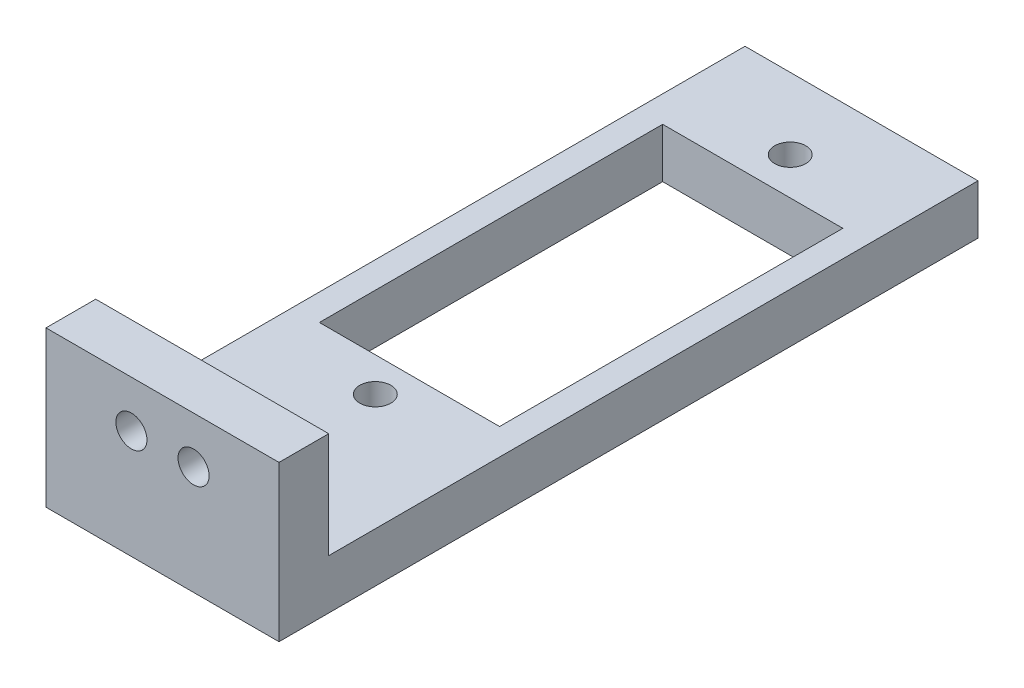
ISO-10303-21;
HEADER;
FILE_DESCRIPTION(('STEP AP214'),'2;1');
FILE_NAME('part.step','',(''),(''),'','','');
FILE_SCHEMA(('AUTOMOTIVE_DESIGN { 1 0 10303 214 1 1 1 1 }'));
ENDSEC;
DATA;
#1=APPLICATION_CONTEXT('core data for automotive mechanical design processes');
#2=APPLICATION_PROTOCOL_DEFINITION('international standard','automotive_design',2000,#1);
#3=PRODUCT_CONTEXT('',#1,'mechanical');
#4=PRODUCT('Part','Part','',(#3));
#5=PRODUCT_RELATED_PRODUCT_CATEGORY('part','',(#4));
#6=PRODUCT_DEFINITION_FORMATION('','',#4);
#7=PRODUCT_DEFINITION_CONTEXT('part definition',#1,'design');
#8=PRODUCT_DEFINITION('design','',#6,#7);
#9=PRODUCT_DEFINITION_SHAPE('','',#8);
#10=(LENGTH_UNIT() NAMED_UNIT(*) SI_UNIT(.MILLI.,.METRE.));
#11=(NAMED_UNIT(*) PLANE_ANGLE_UNIT() SI_UNIT($,.RADIAN.));
#12=(NAMED_UNIT(*) SI_UNIT($,.STERADIAN.) SOLID_ANGLE_UNIT());
#13=UNCERTAINTY_MEASURE_WITH_UNIT(LENGTH_MEASURE(1.E-05),#10,'distance_accuracy_value','');
#14=(GEOMETRIC_REPRESENTATION_CONTEXT(3) GLOBAL_UNCERTAINTY_ASSIGNED_CONTEXT((#13)) GLOBAL_UNIT_ASSIGNED_CONTEXT((#10,
#11,#12)) REPRESENTATION_CONTEXT('',''));
#15=CARTESIAN_POINT('',(0.,0.,0.));
#16=DIRECTION('',(0.,0.,1.));
#17=DIRECTION('',(1.,0.,0.));
#18=AXIS2_PLACEMENT_3D('',#15,#16,#17);
#19=CARTESIAN_POINT('',(7.5,10.,-22.5));
#20=DIRECTION('',(-1.,0.,0.));
#21=DIRECTION('',(0.,0.,1.));
#22=AXIS2_PLACEMENT_3D('',#19,#20,#21);
#23=PLANE('',#22);
#24=DIRECTION('',(0.,-1.,0.));
#25=VECTOR('',#24,1.);
#26=CARTESIAN_POINT('',(7.5,10.,-22.5));
#27=LINE('',#26,#25);
#28=CARTESIAN_POINT('',(7.5,3.2,-22.5));
#29=VERTEX_POINT('',#28);
#30=CARTESIAN_POINT('',(7.5,0.,-22.5));
#31=VERTEX_POINT('',#30);
#32=EDGE_CURVE('E11',#29,#31,#27,.T.);
#33=ORIENTED_EDGE('',*,*,#32,.F.);
#34=DIRECTION('',(0.,0.,-1.));
#35=VECTOR('',#34,1.);
#36=CARTESIAN_POINT('',(7.5,3.2,19.3));
#37=LINE('',#36,#35);
#38=CARTESIAN_POINT('',(7.5,3.2,19.3));
#39=VERTEX_POINT('',#38);
#40=EDGE_CURVE('E195',#39,#29,#37,.T.);
#41=ORIENTED_EDGE('',*,*,#40,.F.);
#42=DIRECTION('',(0.,-1.,0.));
#43=VECTOR('',#42,1.);
#44=CARTESIAN_POINT('',(7.5,3.2,19.3));
#45=LINE('',#44,#43);
#46=CARTESIAN_POINT('',(7.5,10.,19.3));
#47=VERTEX_POINT('',#46);
#48=EDGE_CURVE('E180',#47,#39,#45,.T.);
#49=ORIENTED_EDGE('',*,*,#48,.F.);
#50=DIRECTION('',(0.,0.,-1.));
#51=VECTOR('',#50,1.);
#52=CARTESIAN_POINT('',(7.5,10.,-22.5));
#53=LINE('',#52,#51);
#54=CARTESIAN_POINT('',(7.5,10.,22.5));
#55=VERTEX_POINT('',#54);
#56=EDGE_CURVE('E205',#55,#47,#53,.T.);
#57=ORIENTED_EDGE('',*,*,#56,.F.);
#58=DIRECTION('',(0.,-1.,0.));
#59=VECTOR('',#58,1.);
#60=CARTESIAN_POINT('',(7.5,10.,22.5));
#61=LINE('',#60,#59);
#62=CARTESIAN_POINT('',(7.5,0.,22.5));
#63=VERTEX_POINT('',#62);
#64=EDGE_CURVE('E216',#55,#63,#61,.T.);
#65=ORIENTED_EDGE('',*,*,#64,.T.);
#66=DIRECTION('',(0.,0.,-1.));
#67=VECTOR('',#66,1.);
#68=CARTESIAN_POINT('',(7.5,0.,-22.5));
#69=LINE('',#68,#67);
#70=EDGE_CURVE('E202',#63,#31,#69,.T.);
#71=ORIENTED_EDGE('',*,*,#70,.T.);
#72=EDGE_LOOP('',(#33,#41,#49,#57,#65,#71));
#73=FACE_BOUND('',#72,.T.);
#74=ADVANCED_FACE('F41',(#73),#23,.F.);
#75=CARTESIAN_POINT('',(-7.5,10.,-22.5));
#76=DIRECTION('',(0.,0.,1.));
#77=DIRECTION('',(1.,0.,0.));
#78=AXIS2_PLACEMENT_3D('',#75,#76,#77);
#79=PLANE('',#78);
#80=DIRECTION('',(0.,-1.,0.));
#81=VECTOR('',#80,1.);
#82=CARTESIAN_POINT('',(-7.5,10.,-22.5));
#83=LINE('',#82,#81);
#84=CARTESIAN_POINT('',(-7.5,3.2,-22.5));
#85=VERTEX_POINT('',#84);
#86=CARTESIAN_POINT('',(-7.5,0.,-22.5));
#87=VERTEX_POINT('',#86);
#88=EDGE_CURVE('E50',#85,#87,#83,.T.);
#89=ORIENTED_EDGE('',*,*,#88,.F.);
#90=DIRECTION('',(-1.,0.,0.));
#91=VECTOR('',#90,1.);
#92=CARTESIAN_POINT('',(7.5,3.2,-22.5));
#93=LINE('',#92,#91);
#94=EDGE_CURVE('E185',#29,#85,#93,.T.);
#95=ORIENTED_EDGE('',*,*,#94,.F.);
#96=ORIENTED_EDGE('',*,*,#32,.T.);
#97=DIRECTION('',(-1.,0.,0.));
#98=VECTOR('',#97,1.);
#99=CARTESIAN_POINT('',(-7.5,0.,-22.5));
#100=LINE('',#99,#98);
#101=EDGE_CURVE('E220',#31,#87,#100,.T.);
#102=ORIENTED_EDGE('',*,*,#101,.T.);
#103=EDGE_LOOP('',(#89,#95,#96,#102));
#104=FACE_BOUND('',#103,.T.);
#105=ADVANCED_FACE('F261',(#104),#79,.F.);
#106=CARTESIAN_POINT('',(-7.5,10.,-22.5));
#107=DIRECTION('',(1.,0.,0.));
#108=DIRECTION('',(0.,0.,-1.));
#109=AXIS2_PLACEMENT_3D('',#106,#107,#108);
#110=PLANE('',#109);
#111=DIRECTION('',(0.,1.,0.));
#112=VECTOR('',#111,1.);
#113=CARTESIAN_POINT('',(-7.5,3.2,19.3));
#114=LINE('',#113,#112);
#115=CARTESIAN_POINT('',(-7.5,3.2,19.3));
#116=VERTEX_POINT('',#115);
#117=CARTESIAN_POINT('',(-7.5,10.,19.3));
#118=VERTEX_POINT('',#117);
#119=EDGE_CURVE('E189',#116,#118,#114,.T.);
#120=ORIENTED_EDGE('',*,*,#119,.F.);
#121=DIRECTION('',(0.,0.,-1.));
#122=VECTOR('',#121,1.);
#123=CARTESIAN_POINT('',(-7.5,3.2,19.3));
#124=LINE('',#123,#122);
#125=EDGE_CURVE('E198',#116,#85,#124,.T.);
#126=ORIENTED_EDGE('',*,*,#125,.T.);
#127=ORIENTED_EDGE('',*,*,#88,.T.);
#128=DIRECTION('',(0.,0.,1.));
#129=VECTOR('',#128,1.);
#130=CARTESIAN_POINT('',(-7.5,0.,-22.5));
#131=LINE('',#130,#129);
#132=CARTESIAN_POINT('',(-7.5,0.,22.5));
#133=VERTEX_POINT('',#132);
#134=EDGE_CURVE('E224',#87,#133,#131,.T.);
#135=ORIENTED_EDGE('',*,*,#134,.T.);
#136=DIRECTION('',(0.,-1.,0.));
#137=VECTOR('',#136,1.);
#138=CARTESIAN_POINT('',(-7.5,10.,22.5));
#139=LINE('',#138,#137);
#140=CARTESIAN_POINT('',(-7.5,10.,22.5));
#141=VERTEX_POINT('',#140);
#142=EDGE_CURVE('E232',#141,#133,#139,.T.);
#143=ORIENTED_EDGE('',*,*,#142,.F.);
#144=DIRECTION('',(0.,0.,1.));
#145=VECTOR('',#144,1.);
#146=CARTESIAN_POINT('',(-7.5,10.,-22.5));
#147=LINE('',#146,#145);
#148=EDGE_CURVE('E209',#118,#141,#147,.T.);
#149=ORIENTED_EDGE('',*,*,#148,.F.);
#150=EDGE_LOOP('',(#120,#126,#127,#135,#143,#149));
#151=FACE_BOUND('',#150,.T.);
#152=ADVANCED_FACE('F266',(#151),#110,.F.);
#153=CARTESIAN_POINT('',(-7.5,10.,22.5));
#154=DIRECTION('',(0.,0.,-1.));
#155=DIRECTION('',(-1.,0.,0.));
#156=AXIS2_PLACEMENT_3D('',#153,#154,#155);
#157=PLANE('',#156);
#158=CARTESIAN_POINT('',(-2.,7.,22.5));
#159=DIRECTION('',(0.,0.,1.));
#160=DIRECTION('',(1.,0.,0.));
#161=AXIS2_PLACEMENT_3D('',#158,#159,#160);
#162=CIRCLE('',#161,0.99999999999984);
#163=CARTESIAN_POINT('',(-1.00000000000016,7.,22.5));
#164=VERTEX_POINT('',#163);
#165=EDGE_CURVE('E172',#164,#164,#162,.T.);
#166=ORIENTED_EDGE('',*,*,#165,.F.);
#167=EDGE_LOOP('',(#166));
#168=FACE_BOUND('',#167,.T.);
#169=CARTESIAN_POINT('',(2.,7.,22.5));
#170=DIRECTION('',(0.,0.,1.));
#171=DIRECTION('',(1.,0.,0.));
#172=AXIS2_PLACEMENT_3D('',#169,#170,#171);
#173=CIRCLE('',#172,1.);
#174=CARTESIAN_POINT('',(3.,7.,22.5));
#175=VERTEX_POINT('',#174);
#176=EDGE_CURVE('E166',#175,#175,#173,.T.);
#177=ORIENTED_EDGE('',*,*,#176,.F.);
#178=EDGE_LOOP('',(#177));
#179=FACE_BOUND('',#178,.T.);
#180=DIRECTION('',(1.,0.,0.));
#181=VECTOR('',#180,1.);
#182=CARTESIAN_POINT('',(-7.5,0.,22.5));
#183=LINE('',#182,#181);
#184=EDGE_CURVE('E210',#133,#63,#183,.T.);
#185=ORIENTED_EDGE('',*,*,#184,.T.);
#186=ORIENTED_EDGE('',*,*,#64,.F.);
#187=DIRECTION('',(1.,0.,0.));
#188=VECTOR('',#187,1.);
#189=CARTESIAN_POINT('',(-7.5,10.,22.5));
#190=LINE('',#189,#188);
#191=EDGE_CURVE('E213',#141,#55,#190,.T.);
#192=ORIENTED_EDGE('',*,*,#191,.F.);
#193=ORIENTED_EDGE('',*,*,#142,.T.);
#194=EDGE_LOOP('',(#185,#186,#192,#193));
#195=FACE_BOUND('',#194,.T.);
#196=ADVANCED_FACE('F283',(#168,#179,#195),#157,.F.);
#197=CARTESIAN_POINT('',(0.,10.,0.));
#198=DIRECTION('',(0.,1.,0.));
#199=DIRECTION('',(0.,0.,1.));
#200=AXIS2_PLACEMENT_3D('',#197,#198,#199);
#201=PLANE('',#200);
#202=DIRECTION('',(1.,0.,0.));
#203=VECTOR('',#202,1.);
#204=CARTESIAN_POINT('',(7.5,10.,19.3));
#205=LINE('',#204,#203);
#206=EDGE_CURVE('E192',#118,#47,#205,.T.);
#207=ORIENTED_EDGE('',*,*,#206,.F.);
#208=ORIENTED_EDGE('',*,*,#148,.T.);
#209=ORIENTED_EDGE('',*,*,#191,.T.);
#210=ORIENTED_EDGE('',*,*,#56,.T.);
#211=EDGE_LOOP('',(#207,#208,#209,#210));
#212=FACE_BOUND('',#211,.T.);
#213=ADVANCED_FACE('F288',(#212),#201,.T.);
#214=CARTESIAN_POINT('',(0.,0.,0.));
#215=DIRECTION('',(0.,1.,0.));
#216=DIRECTION('',(0.,0.,1.));
#217=AXIS2_PLACEMENT_3D('',#214,#215,#216);
#218=PLANE('',#217);
#219=CARTESIAN_POINT('',(0.,0.,-17.91));
#220=DIRECTION('',(0.,1.,0.));
#221=DIRECTION('',(0.,0.,1.));
#222=AXIS2_PLACEMENT_3D('',#219,#220,#221);
#223=CIRCLE('',#222,1.);
#224=CARTESIAN_POINT('',(0.,0.,-16.91));
#225=VERTEX_POINT('',#224);
#226=EDGE_CURVE('E396',#225,#225,#223,.T.);
#227=ORIENTED_EDGE('',*,*,#226,.T.);
#228=EDGE_LOOP('',(#227));
#229=FACE_BOUND('',#228,.T.);
#230=CARTESIAN_POINT('',(0.,0.,8.80000000000001));
#231=DIRECTION('',(0.,1.,0.));
#232=DIRECTION('',(0.,0.,1.));
#233=AXIS2_PLACEMENT_3D('',#230,#231,#232);
#234=CIRCLE('',#233,1.);
#235=CARTESIAN_POINT('',(0.,0.,9.80000000000001));
#236=VERTEX_POINT('',#235);
#237=EDGE_CURVE('E157',#236,#236,#234,.T.);
#238=ORIENTED_EDGE('',*,*,#237,.T.);
#239=EDGE_LOOP('',(#238));
#240=FACE_BOUND('',#239,.T.);
#241=DIRECTION('',(-1.,0.,0.));
#242=VECTOR('',#241,1.);
#243=CARTESIAN_POINT('',(5.8,0.,-15.5));
#244=LINE('',#243,#242);
#245=CARTESIAN_POINT('',(5.8,0.,-15.5));
#246=VERTEX_POINT('',#245);
#247=CARTESIAN_POINT('',(-5.8,0.,-15.5));
#248=VERTEX_POINT('',#247);
#249=EDGE_CURVE('E128',#246,#248,#244,.T.);
#250=ORIENTED_EDGE('',*,*,#249,.T.);
#251=DIRECTION('',(0.,0.,1.));
#252=VECTOR('',#251,1.);
#253=CARTESIAN_POINT('',(-5.8,0.,-15.5));
#254=LINE('',#253,#252);
#255=CARTESIAN_POINT('',(-5.8,0.,6.60000000000001));
#256=VERTEX_POINT('',#255);
#257=EDGE_CURVE('E121',#248,#256,#254,.T.);
#258=ORIENTED_EDGE('',*,*,#257,.T.);
#259=DIRECTION('',(1.,0.,0.));
#260=VECTOR('',#259,1.);
#261=CARTESIAN_POINT('',(5.8,0.,6.60000000000001));
#262=LINE('',#261,#260);
#263=CARTESIAN_POINT('',(5.8,0.,6.60000000000001));
#264=VERTEX_POINT('',#263);
#265=EDGE_CURVE('E131',#256,#264,#262,.T.);
#266=ORIENTED_EDGE('',*,*,#265,.T.);
#267=DIRECTION('',(0.,0.,-1.));
#268=VECTOR('',#267,1.);
#269=CARTESIAN_POINT('',(5.8,0.,-15.5));
#270=LINE('',#269,#268);
#271=EDGE_CURVE('E58',#264,#246,#270,.T.);
#272=ORIENTED_EDGE('',*,*,#271,.T.);
#273=EDGE_LOOP('',(#250,#258,#266,#272));
#274=FACE_BOUND('',#273,.T.);
#275=ORIENTED_EDGE('',*,*,#70,.F.);
#276=ORIENTED_EDGE('',*,*,#184,.F.);
#277=ORIENTED_EDGE('',*,*,#134,.F.);
#278=ORIENTED_EDGE('',*,*,#101,.F.);
#279=EDGE_LOOP('',(#275,#276,#277,#278));
#280=FACE_BOUND('',#279,.T.);
#281=ADVANCED_FACE('F136',(#229,#240,#274,#280),#218,.F.);
#282=CARTESIAN_POINT('',(7.5,3.2,19.3));
#283=DIRECTION('',(0.,-1.,0.));
#284=DIRECTION('',(0.,0.,-1.));
#285=AXIS2_PLACEMENT_3D('',#282,#283,#284);
#286=PLANE('',#285);
#287=CARTESIAN_POINT('',(0.,3.2,-17.91));
#288=DIRECTION('',(0.,1.,0.));
#289=DIRECTION('',(0.,0.,1.));
#290=AXIS2_PLACEMENT_3D('',#287,#288,#289);
#291=CIRCLE('',#290,1.);
#292=CARTESIAN_POINT('',(0.,3.2,-16.91));
#293=VERTEX_POINT('',#292);
#294=EDGE_CURVE('E147',#293,#293,#291,.T.);
#295=ORIENTED_EDGE('',*,*,#294,.F.);
#296=EDGE_LOOP('',(#295));
#297=FACE_BOUND('',#296,.T.);
#298=CARTESIAN_POINT('',(0.,3.2,8.80000000000001));
#299=DIRECTION('',(0.,1.,0.));
#300=DIRECTION('',(0.,0.,1.));
#301=AXIS2_PLACEMENT_3D('',#298,#299,#300);
#302=CIRCLE('',#301,1.);
#303=CARTESIAN_POINT('',(0.,3.2,9.80000000000001));
#304=VERTEX_POINT('',#303);
#305=EDGE_CURVE('E400',#304,#304,#302,.T.);
#306=ORIENTED_EDGE('',*,*,#305,.F.);
#307=EDGE_LOOP('',(#306));
#308=FACE_BOUND('',#307,.T.);
#309=DIRECTION('',(1.,0.,0.));
#310=VECTOR('',#309,1.);
#311=CARTESIAN_POINT('',(5.8,3.2,6.60000000000001));
#312=LINE('',#311,#310);
#313=CARTESIAN_POINT('',(-5.8,3.2,6.60000000000001));
#314=VERTEX_POINT('',#313);
#315=CARTESIAN_POINT('',(5.8,3.2,6.60000000000001));
#316=VERTEX_POINT('',#315);
#317=EDGE_CURVE('E156',#314,#316,#312,.T.);
#318=ORIENTED_EDGE('',*,*,#317,.F.);
#319=DIRECTION('',(0.,0.,1.));
#320=VECTOR('',#319,1.);
#321=CARTESIAN_POINT('',(-5.8,3.2,-15.5));
#322=LINE('',#321,#320);
#323=CARTESIAN_POINT('',(-5.8,3.2,-15.5));
#324=VERTEX_POINT('',#323);
#325=EDGE_CURVE('E66',#324,#314,#322,.T.);
#326=ORIENTED_EDGE('',*,*,#325,.F.);
#327=DIRECTION('',(-1.,0.,0.));
#328=VECTOR('',#327,1.);
#329=CARTESIAN_POINT('',(5.8,3.2,-15.5));
#330=LINE('',#329,#328);
#331=CARTESIAN_POINT('',(5.8,3.2,-15.5));
#332=VERTEX_POINT('',#331);
#333=EDGE_CURVE('E140',#332,#324,#330,.T.);
#334=ORIENTED_EDGE('',*,*,#333,.F.);
#335=DIRECTION('',(0.,0.,-1.));
#336=VECTOR('',#335,1.);
#337=CARTESIAN_POINT('',(5.8,3.2,-15.5));
#338=LINE('',#337,#336);
#339=EDGE_CURVE('E144',#316,#332,#338,.T.);
#340=ORIENTED_EDGE('',*,*,#339,.F.);
#341=EDGE_LOOP('',(#318,#326,#334,#340));
#342=FACE_BOUND('',#341,.T.);
#343=ORIENTED_EDGE('',*,*,#94,.T.);
#344=ORIENTED_EDGE('',*,*,#125,.F.);
#345=DIRECTION('',(-1.,0.,0.));
#346=VECTOR('',#345,1.);
#347=CARTESIAN_POINT('',(7.5,3.2,19.3));
#348=LINE('',#347,#346);
#349=EDGE_CURVE('E184',#39,#116,#348,.T.);
#350=ORIENTED_EDGE('',*,*,#349,.F.);
#351=ORIENTED_EDGE('',*,*,#40,.T.);
#352=EDGE_LOOP('',(#343,#344,#350,#351));
#353=FACE_BOUND('',#352,.T.);
#354=ADVANCED_FACE('F291',(#297,#308,#342,#353),#286,.F.);
#355=CARTESIAN_POINT('',(0.,0.,19.3));
#356=DIRECTION('',(0.,0.,1.));
#357=DIRECTION('',(1.,0.,0.));
#358=AXIS2_PLACEMENT_3D('',#355,#356,#357);
#359=PLANE('',#358);
#360=CARTESIAN_POINT('',(-2.,7.,19.3));
#361=DIRECTION('',(0.,0.,1.));
#362=DIRECTION('',(1.,0.,0.));
#363=AXIS2_PLACEMENT_3D('',#360,#361,#362);
#364=CIRCLE('',#363,0.99999999999984);
#365=CARTESIAN_POINT('',(-1.00000000000016,7.,19.3));
#366=VERTEX_POINT('',#365);
#367=EDGE_CURVE('E44',#366,#366,#364,.T.);
#368=ORIENTED_EDGE('',*,*,#367,.T.);
#369=EDGE_LOOP('',(#368));
#370=FACE_BOUND('',#369,.T.);
#371=CARTESIAN_POINT('',(2.,7.,19.3));
#372=DIRECTION('',(0.,0.,1.));
#373=DIRECTION('',(1.,0.,0.));
#374=AXIS2_PLACEMENT_3D('',#371,#372,#373);
#375=CIRCLE('',#374,1.);
#376=CARTESIAN_POINT('',(3.,7.,19.3));
#377=VERTEX_POINT('',#376);
#378=EDGE_CURVE('E176',#377,#377,#375,.T.);
#379=ORIENTED_EDGE('',*,*,#378,.T.);
#380=EDGE_LOOP('',(#379));
#381=FACE_BOUND('',#380,.T.);
#382=ORIENTED_EDGE('',*,*,#48,.T.);
#383=ORIENTED_EDGE('',*,*,#349,.T.);
#384=ORIENTED_EDGE('',*,*,#119,.T.);
#385=ORIENTED_EDGE('',*,*,#206,.T.);
#386=EDGE_LOOP('',(#382,#383,#384,#385));
#387=FACE_BOUND('',#386,.T.);
#388=ADVANCED_FACE('F245',(#370,#381,#387),#359,.F.);
#389=CARTESIAN_POINT('',(2.,7.,-22.5));
#390=DIRECTION('',(0.,0.,1.));
#391=DIRECTION('',(1.,0.,0.));
#392=AXIS2_PLACEMENT_3D('',#389,#390,#391);
#393=CYLINDRICAL_SURFACE('',#392,1.);
#394=CARTESIAN_POINT('',(3.,7.,22.5));
#395=CARTESIAN_POINT('',(3.,7.,22.4666666666667));
#396=CARTESIAN_POINT('',(3.,7.,22.4333333333333));
#397=CARTESIAN_POINT('',(3.,7.,22.3666666666667));
#398=CARTESIAN_POINT('',(3.,7.,22.3333333333333));
#399=CARTESIAN_POINT('',(3.,7.,22.2666666666667));
#400=CARTESIAN_POINT('',(3.,7.,22.2333333333333));
#401=CARTESIAN_POINT('',(3.,7.,22.1666666666667));
#402=CARTESIAN_POINT('',(3.,7.,22.1333333333333));
#403=CARTESIAN_POINT('',(3.,7.,22.0666666666667));
#404=CARTESIAN_POINT('',(3.,7.,22.0333333333333));
#405=CARTESIAN_POINT('',(3.,7.,21.9666666666667));
#406=CARTESIAN_POINT('',(3.,7.,21.9333333333333));
#407=CARTESIAN_POINT('',(3.,7.,21.8666666666667));
#408=CARTESIAN_POINT('',(3.,7.,21.8333333333333));
#409=CARTESIAN_POINT('',(3.,7.,21.7666666666667));
#410=CARTESIAN_POINT('',(3.,7.,21.7333333333333));
#411=CARTESIAN_POINT('',(3.,7.,21.6666666666667));
#412=CARTESIAN_POINT('',(3.,7.,21.6333333333333));
#413=CARTESIAN_POINT('',(3.,7.,21.5666666666667));
#414=CARTESIAN_POINT('',(3.,7.,21.5333333333333));
#415=CARTESIAN_POINT('',(3.,7.,21.4666666666667));
#416=CARTESIAN_POINT('',(3.,7.,21.4333333333333));
#417=CARTESIAN_POINT('',(3.,7.,21.3666666666667));
#418=CARTESIAN_POINT('',(3.,7.,21.3333333333333));
#419=CARTESIAN_POINT('',(3.,7.,21.2666666666667));
#420=CARTESIAN_POINT('',(3.,7.,21.2333333333333));
#421=CARTESIAN_POINT('',(3.,7.,21.1666666666667));
#422=CARTESIAN_POINT('',(3.,7.,21.1333333333333));
#423=CARTESIAN_POINT('',(3.,7.,21.0666666666667));
#424=CARTESIAN_POINT('',(3.,7.,21.0333333333333));
#425=CARTESIAN_POINT('',(3.,7.,20.9666666666667));
#426=CARTESIAN_POINT('',(3.,7.,20.9333333333333));
#427=CARTESIAN_POINT('',(3.,7.,20.8666666666667));
#428=CARTESIAN_POINT('',(3.,7.,20.8333333333333));
#429=CARTESIAN_POINT('',(3.,7.,20.7666666666667));
#430=CARTESIAN_POINT('',(3.,7.,20.7333333333333));
#431=CARTESIAN_POINT('',(3.,7.,20.6666666666667));
#432=CARTESIAN_POINT('',(3.,7.,20.6333333333333));
#433=CARTESIAN_POINT('',(3.,7.,20.5666666666667));
#434=CARTESIAN_POINT('',(3.,7.,20.5333333333333));
#435=CARTESIAN_POINT('',(3.,7.,20.4666666666667));
#436=CARTESIAN_POINT('',(3.,7.,20.4333333333333));
#437=CARTESIAN_POINT('',(3.,7.,20.3666666666667));
#438=CARTESIAN_POINT('',(3.,7.,20.3333333333333));
#439=CARTESIAN_POINT('',(3.,7.,20.2666666666667));
#440=CARTESIAN_POINT('',(3.,7.,20.2333333333333));
#441=CARTESIAN_POINT('',(3.,7.,20.1666666666667));
#442=CARTESIAN_POINT('',(3.,7.,20.1333333333333));
#443=CARTESIAN_POINT('',(3.,7.,20.0666666666667));
#444=CARTESIAN_POINT('',(3.,7.,20.0333333333333));
#445=CARTESIAN_POINT('',(3.,7.,19.9666666666667));
#446=CARTESIAN_POINT('',(3.,7.,19.9333333333333));
#447=CARTESIAN_POINT('',(3.,7.,19.8666666666667));
#448=CARTESIAN_POINT('',(3.,7.,19.8333333333333));
#449=CARTESIAN_POINT('',(3.,7.,19.7666666666667));
#450=CARTESIAN_POINT('',(3.,7.,19.7333333333333));
#451=CARTESIAN_POINT('',(3.,7.,19.6666666666667));
#452=CARTESIAN_POINT('',(3.,7.,19.6333333333333));
#453=CARTESIAN_POINT('',(3.,7.,19.5666666666667));
#454=CARTESIAN_POINT('',(3.,7.,19.5333333333333));
#455=CARTESIAN_POINT('',(3.,7.,19.4666666666667));
#456=CARTESIAN_POINT('',(3.,7.,19.4333333333333));
#457=CARTESIAN_POINT('',(3.,7.,19.3666666666667));
#458=CARTESIAN_POINT('',(3.,7.,19.3333333333333));
#459=CARTESIAN_POINT('',(3.,7.,19.3));
#460=B_SPLINE_CURVE_WITH_KNOTS('',3,(#394,#395,#396,#397,#398,#399,#400,#401,#402,#403,#404,
#405,#406,#407,#408,#409,#410,#411,#412,#413,#414,#415,#416,#417,#418,#419,#420,#421,#422,#423,
#424,#425,#426,#427,#428,#429,#430,#431,#432,#433,#434,#435,#436,#437,#438,#439,#440,#441,#442,
#443,#444,#445,#446,#447,#448,#449,#450,#451,#452,#453,#454,#455,#456,#457,#458,#459),
.UNSPECIFIED.,.F.,.F.,(4,2,2,2,2,2,2,2,2,2,2,2,2,2,2,2,2,2,2,2,2,2,2,2,2,2,2,2,2,2,2,2,4),(0.,
0.100000000000003,0.199999999999999,0.300000000000002,0.399999999999998,0.5,0.599999999999996,
0.699999999999999,0.799999999999995,0.899999999999998,1.,1.1,1.2,1.3,1.4,1.49999999999999,1.6,
1.7,1.8,1.9,1.99999999999999,2.1,2.19999999999999,2.3,2.4,2.5,2.6,2.69999999999999,2.8,
2.89999999999999,3.,3.09999999999999,3.19999999999999),.UNSPECIFIED.);
#461=EDGE_CURVE('BSEAM249',#175,#377,#460,.T.);
#462=ORIENTED_EDGE('',*,*,#176,.T.);
#463=ORIENTED_EDGE('',*,*,#378,.F.);
#464=ORIENTED_EDGE('',*,*,#461,.T.);
#465=ORIENTED_EDGE('',*,*,#461,.F.);
#466=EDGE_LOOP('',(#462,#464,#463,#465));
#467=FACE_BOUND('',#466,.T.);
#468=ADVANCED_FACE('F249',(#467),#393,.F.);
#469=CARTESIAN_POINT('',(-2.,7.,-22.5));
#470=DIRECTION('',(0.,0.,1.));
#471=DIRECTION('',(1.,0.,0.));
#472=AXIS2_PLACEMENT_3D('',#469,#470,#471);
#473=CYLINDRICAL_SURFACE('',#472,0.99999999999984);
#474=CARTESIAN_POINT('',(-1.00000000000016,7.,22.5));
#475=CARTESIAN_POINT('',(-1.00000000000016,7.,22.4666666666667));
#476=CARTESIAN_POINT('',(-1.00000000000016,7.,22.4333333333333));
#477=CARTESIAN_POINT('',(-1.00000000000016,7.,22.3666666666667));
#478=CARTESIAN_POINT('',(-1.00000000000016,7.,22.3333333333333));
#479=CARTESIAN_POINT('',(-1.00000000000016,7.,22.2666666666667));
#480=CARTESIAN_POINT('',(-1.00000000000016,7.,22.2333333333333));
#481=CARTESIAN_POINT('',(-1.00000000000016,7.,22.1666666666667));
#482=CARTESIAN_POINT('',(-1.00000000000016,7.,22.1333333333333));
#483=CARTESIAN_POINT('',(-1.00000000000016,7.,22.0666666666667));
#484=CARTESIAN_POINT('',(-1.00000000000016,7.,22.0333333333333));
#485=CARTESIAN_POINT('',(-1.00000000000016,7.,21.9666666666667));
#486=CARTESIAN_POINT('',(-1.00000000000016,7.,21.9333333333333));
#487=CARTESIAN_POINT('',(-1.00000000000016,7.,21.8666666666667));
#488=CARTESIAN_POINT('',(-1.00000000000016,7.,21.8333333333333));
#489=CARTESIAN_POINT('',(-1.00000000000016,7.,21.7666666666667));
#490=CARTESIAN_POINT('',(-1.00000000000016,7.,21.7333333333333));
#491=CARTESIAN_POINT('',(-1.00000000000016,7.,21.6666666666667));
#492=CARTESIAN_POINT('',(-1.00000000000016,7.,21.6333333333333));
#493=CARTESIAN_POINT('',(-1.00000000000016,7.,21.5666666666667));
#494=CARTESIAN_POINT('',(-1.00000000000016,7.,21.5333333333333));
#495=CARTESIAN_POINT('',(-1.00000000000016,7.,21.4666666666667));
#496=CARTESIAN_POINT('',(-1.00000000000016,7.,21.4333333333333));
#497=CARTESIAN_POINT('',(-1.00000000000016,7.,21.3666666666667));
#498=CARTESIAN_POINT('',(-1.00000000000016,7.,21.3333333333333));
#499=CARTESIAN_POINT('',(-1.00000000000016,7.,21.2666666666667));
#500=CARTESIAN_POINT('',(-1.00000000000016,7.,21.2333333333333));
#501=CARTESIAN_POINT('',(-1.00000000000016,7.,21.1666666666667));
#502=CARTESIAN_POINT('',(-1.00000000000016,7.,21.1333333333333));
#503=CARTESIAN_POINT('',(-1.00000000000016,7.,21.0666666666667));
#504=CARTESIAN_POINT('',(-1.00000000000016,7.,21.0333333333333));
#505=CARTESIAN_POINT('',(-1.00000000000016,7.,20.9666666666667));
#506=CARTESIAN_POINT('',(-1.00000000000016,7.,20.9333333333333));
#507=CARTESIAN_POINT('',(-1.00000000000016,7.,20.8666666666667));
#508=CARTESIAN_POINT('',(-1.00000000000016,7.,20.8333333333333));
#509=CARTESIAN_POINT('',(-1.00000000000016,7.,20.7666666666667));
#510=CARTESIAN_POINT('',(-1.00000000000016,7.,20.7333333333333));
#511=CARTESIAN_POINT('',(-1.00000000000016,7.,20.6666666666667));
#512=CARTESIAN_POINT('',(-1.00000000000016,7.,20.6333333333333));
#513=CARTESIAN_POINT('',(-1.00000000000016,7.,20.5666666666667));
#514=CARTESIAN_POINT('',(-1.00000000000016,7.,20.5333333333333));
#515=CARTESIAN_POINT('',(-1.00000000000016,7.,20.4666666666667));
#516=CARTESIAN_POINT('',(-1.00000000000016,7.,20.4333333333333));
#517=CARTESIAN_POINT('',(-1.00000000000016,7.,20.3666666666667));
#518=CARTESIAN_POINT('',(-1.00000000000016,7.,20.3333333333333));
#519=CARTESIAN_POINT('',(-1.00000000000016,7.,20.2666666666667));
#520=CARTESIAN_POINT('',(-1.00000000000016,7.,20.2333333333333));
#521=CARTESIAN_POINT('',(-1.00000000000016,7.,20.1666666666667));
#522=CARTESIAN_POINT('',(-1.00000000000016,7.,20.1333333333333));
#523=CARTESIAN_POINT('',(-1.00000000000016,7.,20.0666666666667));
#524=CARTESIAN_POINT('',(-1.00000000000016,7.,20.0333333333333));
#525=CARTESIAN_POINT('',(-1.00000000000016,7.,19.9666666666667));
#526=CARTESIAN_POINT('',(-1.00000000000016,7.,19.9333333333333));
#527=CARTESIAN_POINT('',(-1.00000000000016,7.,19.8666666666667));
#528=CARTESIAN_POINT('',(-1.00000000000016,7.,19.8333333333333));
#529=CARTESIAN_POINT('',(-1.00000000000016,7.,19.7666666666667));
#530=CARTESIAN_POINT('',(-1.00000000000016,7.,19.7333333333333));
#531=CARTESIAN_POINT('',(-1.00000000000016,7.,19.6666666666667));
#532=CARTESIAN_POINT('',(-1.00000000000016,7.,19.6333333333333));
#533=CARTESIAN_POINT('',(-1.00000000000016,7.,19.5666666666667));
#534=CARTESIAN_POINT('',(-1.00000000000016,7.,19.5333333333333));
#535=CARTESIAN_POINT('',(-1.00000000000016,7.,19.4666666666667));
#536=CARTESIAN_POINT('',(-1.00000000000016,7.,19.4333333333333));
#537=CARTESIAN_POINT('',(-1.00000000000016,7.,19.3666666666667));
#538=CARTESIAN_POINT('',(-1.00000000000016,7.,19.3333333333333));
#539=CARTESIAN_POINT('',(-1.00000000000016,7.,19.3));
#540=B_SPLINE_CURVE_WITH_KNOTS('',3,(#474,#475,#476,#477,#478,#479,#480,#481,#482,#483,#484,
#485,#486,#487,#488,#489,#490,#491,#492,#493,#494,#495,#496,#497,#498,#499,#500,#501,#502,#503,
#504,#505,#506,#507,#508,#509,#510,#511,#512,#513,#514,#515,#516,#517,#518,#519,#520,#521,#522,
#523,#524,#525,#526,#527,#528,#529,#530,#531,#532,#533,#534,#535,#536,#537,#538,#539),
.UNSPECIFIED.,.F.,.F.,(4,2,2,2,2,2,2,2,2,2,2,2,2,2,2,2,2,2,2,2,2,2,2,2,2,2,2,2,2,2,2,2,4),(0.,
0.100000000000003,0.199999999999999,0.300000000000002,0.399999999999998,0.5,0.599999999999996,
0.699999999999999,0.799999999999995,0.899999999999998,1.,1.1,1.2,1.3,1.4,1.49999999999999,1.6,
1.7,1.8,1.9,1.99999999999999,2.1,2.19999999999999,2.3,2.4,2.5,2.6,2.69999999999999,2.8,
2.89999999999999,3.,3.09999999999999,3.19999999999999),.UNSPECIFIED.);
#541=EDGE_CURVE('BSEAM247',#164,#366,#540,.T.);
#542=ORIENTED_EDGE('',*,*,#165,.T.);
#543=ORIENTED_EDGE('',*,*,#367,.F.);
#544=ORIENTED_EDGE('',*,*,#541,.T.);
#545=ORIENTED_EDGE('',*,*,#541,.F.);
#546=EDGE_LOOP('',(#542,#544,#543,#545));
#547=FACE_BOUND('',#546,.T.);
#548=ADVANCED_FACE('F247',(#547),#473,.F.);
#549=CARTESIAN_POINT('',(-5.8,0.,-15.5));
#550=DIRECTION('',(-1.,0.,0.));
#551=DIRECTION('',(0.,0.,1.));
#552=AXIS2_PLACEMENT_3D('',#549,#550,#551);
#553=PLANE('',#552);
#554=ORIENTED_EDGE('',*,*,#325,.T.);
#555=DIRECTION('',(0.,1.,0.));
#556=VECTOR('',#555,1.);
#557=CARTESIAN_POINT('',(-5.8,0.,6.60000000000001));
#558=LINE('',#557,#556);
#559=EDGE_CURVE('E117',#256,#314,#558,.T.);
#560=ORIENTED_EDGE('',*,*,#559,.F.);
#561=ORIENTED_EDGE('',*,*,#257,.F.);
#562=DIRECTION('',(0.,1.,0.));
#563=VECTOR('',#562,1.);
#564=CARTESIAN_POINT('',(-5.8,0.,-15.5));
#565=LINE('',#564,#563);
#566=EDGE_CURVE('E163',#248,#324,#565,.T.);
#567=ORIENTED_EDGE('',*,*,#566,.T.);
#568=EDGE_LOOP('',(#554,#560,#561,#567));
#569=FACE_BOUND('',#568,.T.);
#570=ADVANCED_FACE('F119',(#569),#553,.F.);
#571=CARTESIAN_POINT('',(5.8,0.,-15.5));
#572=DIRECTION('',(0.,0.,-1.));
#573=DIRECTION('',(-1.,0.,0.));
#574=AXIS2_PLACEMENT_3D('',#571,#572,#573);
#575=PLANE('',#574);
#576=ORIENTED_EDGE('',*,*,#333,.T.);
#577=ORIENTED_EDGE('',*,*,#566,.F.);
#578=ORIENTED_EDGE('',*,*,#249,.F.);
#579=DIRECTION('',(0.,1.,0.));
#580=VECTOR('',#579,1.);
#581=CARTESIAN_POINT('',(5.8,0.,-15.5));
#582=LINE('',#581,#580);
#583=EDGE_CURVE('E167',#246,#332,#582,.T.);
#584=ORIENTED_EDGE('',*,*,#583,.T.);
#585=EDGE_LOOP('',(#576,#577,#578,#584));
#586=FACE_BOUND('',#585,.T.);
#587=ADVANCED_FACE('F256',(#586),#575,.F.);
#588=CARTESIAN_POINT('',(5.8,0.,-15.5));
#589=DIRECTION('',(1.,0.,0.));
#590=DIRECTION('',(0.,0.,-1.));
#591=AXIS2_PLACEMENT_3D('',#588,#589,#590);
#592=PLANE('',#591);
#593=ORIENTED_EDGE('',*,*,#339,.T.);
#594=ORIENTED_EDGE('',*,*,#583,.F.);
#595=ORIENTED_EDGE('',*,*,#271,.F.);
#596=DIRECTION('',(0.,1.,0.));
#597=VECTOR('',#596,1.);
#598=CARTESIAN_POINT('',(5.8,0.,6.60000000000001));
#599=LINE('',#598,#597);
#600=EDGE_CURVE('E127',#264,#316,#599,.T.);
#601=ORIENTED_EDGE('',*,*,#600,.T.);
#602=EDGE_LOOP('',(#593,#594,#595,#601));
#603=FACE_BOUND('',#602,.T.);
#604=ADVANCED_FACE('F352',(#603),#592,.F.);
#605=CARTESIAN_POINT('',(5.8,0.,6.60000000000001));
#606=DIRECTION('',(0.,0.,1.));
#607=DIRECTION('',(1.,0.,0.));
#608=AXIS2_PLACEMENT_3D('',#605,#606,#607);
#609=PLANE('',#608);
#610=ORIENTED_EDGE('',*,*,#317,.T.);
#611=ORIENTED_EDGE('',*,*,#600,.F.);
#612=ORIENTED_EDGE('',*,*,#265,.F.);
#613=ORIENTED_EDGE('',*,*,#559,.T.);
#614=EDGE_LOOP('',(#610,#611,#612,#613));
#615=FACE_BOUND('',#614,.T.);
#616=ADVANCED_FACE('F132',(#615),#609,.F.);
#617=CARTESIAN_POINT('',(0.,0.,8.80000000000001));
#618=DIRECTION('',(0.,1.,0.));
#619=DIRECTION('',(0.,0.,1.));
#620=AXIS2_PLACEMENT_3D('',#617,#618,#619);
#621=CYLINDRICAL_SURFACE('',#620,1.);
#622=ORIENTED_EDGE('',*,*,#237,.F.);
#623=EDGE_LOOP('',(#622));
#624=FACE_BOUND('',#623,.T.);
#625=ORIENTED_EDGE('',*,*,#305,.T.);
#626=EDGE_LOOP('',(#625));
#627=FACE_BOUND('',#626,.T.);
#628=ADVANCED_FACE('F370',(#624,#627),#621,.F.);
#629=CARTESIAN_POINT('',(0.,0.,-17.91));
#630=DIRECTION('',(0.,1.,0.));
#631=DIRECTION('',(0.,0.,1.));
#632=AXIS2_PLACEMENT_3D('',#629,#630,#631);
#633=CYLINDRICAL_SURFACE('',#632,1.);
#634=ORIENTED_EDGE('',*,*,#226,.F.);
#635=EDGE_LOOP('',(#634));
#636=FACE_BOUND('',#635,.T.);
#637=ORIENTED_EDGE('',*,*,#294,.T.);
#638=EDGE_LOOP('',(#637));
#639=FACE_BOUND('',#638,.T.);
#640=ADVANCED_FACE('F379',(#636,#639),#633,.F.);
#641=CLOSED_SHELL('',(#74,#105,#152,#196,#213,#281,#354,#388,#468,#548,#570,#587,#604,#616,#628,#640));
#642=MANIFOLD_SOLID_BREP('B2',#641);
#643=ADVANCED_BREP_SHAPE_REPRESENTATION('',(#18,#642),#14);
#644=SHAPE_DEFINITION_REPRESENTATION(#9,#643);
ENDSEC;
END-ISO-10303-21;
